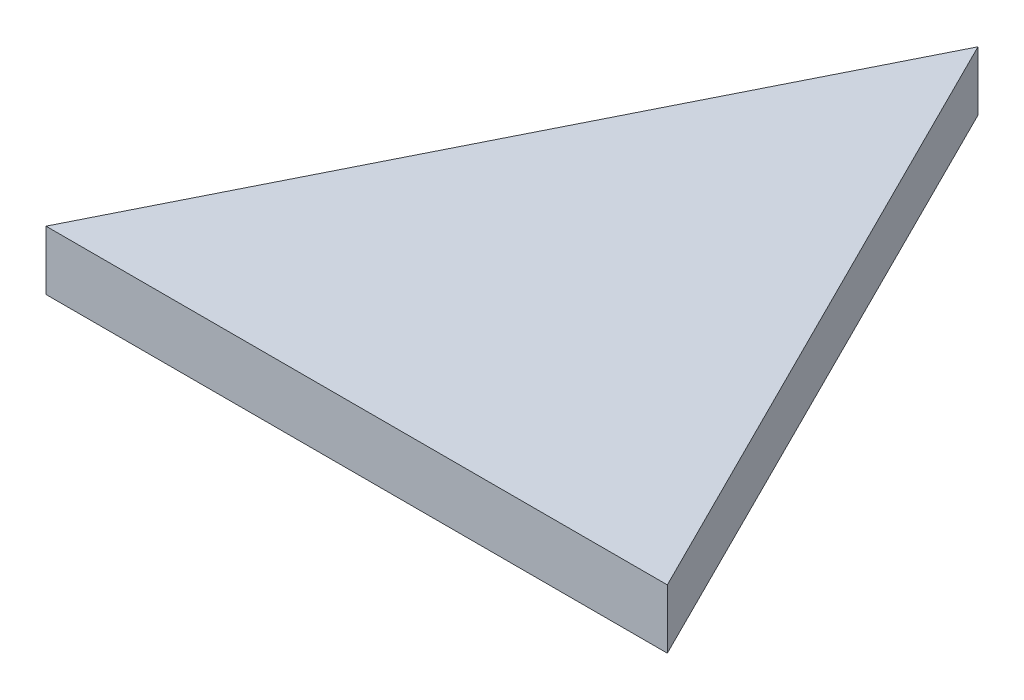
ISO-10303-21;
HEADER;
FILE_DESCRIPTION(('STEP AP214'),'2;1');
FILE_NAME('part.step','',(''),(''),'','','');
FILE_SCHEMA(('AUTOMOTIVE_DESIGN { 1 0 10303 214 1 1 1 1 }'));
ENDSEC;
DATA;
#1=APPLICATION_CONTEXT('core data for automotive mechanical design processes');
#2=APPLICATION_PROTOCOL_DEFINITION('international standard','automotive_design',2000,#1);
#3=PRODUCT_CONTEXT('',#1,'mechanical');
#4=PRODUCT('Part','Part','',(#3));
#5=PRODUCT_RELATED_PRODUCT_CATEGORY('part','',(#4));
#6=PRODUCT_DEFINITION_FORMATION('','',#4);
#7=PRODUCT_DEFINITION_CONTEXT('part definition',#1,'design');
#8=PRODUCT_DEFINITION('design','',#6,#7);
#9=PRODUCT_DEFINITION_SHAPE('','',#8);
#10=(LENGTH_UNIT() NAMED_UNIT(*) SI_UNIT(.MILLI.,.METRE.));
#11=(NAMED_UNIT(*) PLANE_ANGLE_UNIT() SI_UNIT($,.RADIAN.));
#12=(NAMED_UNIT(*) SI_UNIT($,.STERADIAN.) SOLID_ANGLE_UNIT());
#13=UNCERTAINTY_MEASURE_WITH_UNIT(LENGTH_MEASURE(1.E-05),#10,'distance_accuracy_value','');
#14=(GEOMETRIC_REPRESENTATION_CONTEXT(3) GLOBAL_UNCERTAINTY_ASSIGNED_CONTEXT((#13)) GLOBAL_UNIT_ASSIGNED_CONTEXT((#10,
#11,#12)) REPRESENTATION_CONTEXT('',''));
#15=CARTESIAN_POINT('',(0.,0.,0.));
#16=DIRECTION('',(0.,0.,1.));
#17=DIRECTION('',(1.,0.,0.));
#18=AXIS2_PLACEMENT_3D('',#15,#16,#17);
#19=CARTESIAN_POINT('',(0.,150.94635623731,-100.));
#20=DIRECTION('',(0.894427190999916,0.,0.447213595499958));
#21=DIRECTION('',(0.447213595499958,0.,-0.894427190999916));
#22=AXIS2_PLACEMENT_3D('',#19,#20,#21);
#23=PLANE('',#22);
#24=DIRECTION('',(-0.447213595499958,0.,0.894427190999916));
#25=VECTOR('',#24,1.);
#26=CARTESIAN_POINT('',(0.,9.52500000000001,-100.));
#27=LINE('',#26,#25);
#28=CARTESIAN_POINT('',(0.,9.52500000000001,-100.));
#29=VERTEX_POINT('',#28);
#30=CARTESIAN_POINT('',(-50.,9.52500000000001,0.));
#31=VERTEX_POINT('',#30);
#32=EDGE_CURVE('E42',#29,#31,#27,.T.);
#33=ORIENTED_EDGE('',*,*,#32,.F.);
#34=DIRECTION('',(0.,-1.,0.));
#35=VECTOR('',#34,1.);
#36=CARTESIAN_POINT('',(0.,150.94635623731,-100.));
#37=LINE('',#36,#35);
#38=CARTESIAN_POINT('',(0.,0.,-100.));
#39=VERTEX_POINT('',#38);
#40=EDGE_CURVE('E37',#29,#39,#37,.T.);
#41=ORIENTED_EDGE('',*,*,#40,.T.);
#42=DIRECTION('',(-0.447213595499958,0.,0.894427190999916));
#43=VECTOR('',#42,1.);
#44=CARTESIAN_POINT('',(0.,0.,-100.));
#45=LINE('',#44,#43);
#46=CARTESIAN_POINT('',(-50.,0.,0.));
#47=VERTEX_POINT('',#46);
#48=EDGE_CURVE('E72',#39,#47,#45,.T.);
#49=ORIENTED_EDGE('',*,*,#48,.T.);
#50=DIRECTION('',(0.,-1.,0.));
#51=VECTOR('',#50,1.);
#52=CARTESIAN_POINT('',(-50.,150.94635623731,0.));
#53=LINE('',#52,#51);
#54=EDGE_CURVE('E67',#31,#47,#53,.T.);
#55=ORIENTED_EDGE('',*,*,#54,.F.);
#56=EDGE_LOOP('',(#33,#41,#49,#55));
#57=FACE_BOUND('',#56,.T.);
#58=ADVANCED_FACE('F33',(#57),#23,.F.);
#59=CARTESIAN_POINT('',(-50.,150.94635623731,0.));
#60=DIRECTION('',(0.,0.,-1.));
#61=DIRECTION('',(-1.,0.,0.));
#62=AXIS2_PLACEMENT_3D('',#59,#60,#61);
#63=PLANE('',#62);
#64=DIRECTION('',(1.,0.,0.));
#65=VECTOR('',#64,1.);
#66=CARTESIAN_POINT('',(-50.,9.52500000000001,0.));
#67=LINE('',#66,#65);
#68=CARTESIAN_POINT('',(50.,9.52500000000001,0.));
#69=VERTEX_POINT('',#68);
#70=EDGE_CURVE('E11',#31,#69,#67,.T.);
#71=ORIENTED_EDGE('',*,*,#70,.F.);
#72=ORIENTED_EDGE('',*,*,#54,.T.);
#73=DIRECTION('',(1.,0.,0.));
#74=VECTOR('',#73,1.);
#75=CARTESIAN_POINT('',(-50.,0.,0.));
#76=LINE('',#75,#74);
#77=CARTESIAN_POINT('',(50.,0.,0.));
#78=VERTEX_POINT('',#77);
#79=EDGE_CURVE('E82',#47,#78,#76,.T.);
#80=ORIENTED_EDGE('',*,*,#79,.T.);
#81=DIRECTION('',(0.,-1.,0.));
#82=VECTOR('',#81,1.);
#83=CARTESIAN_POINT('',(50.,150.94635623731,0.));
#84=LINE('',#83,#82);
#85=EDGE_CURVE('E55',#69,#78,#84,.T.);
#86=ORIENTED_EDGE('',*,*,#85,.F.);
#87=EDGE_LOOP('',(#71,#72,#80,#86));
#88=FACE_BOUND('',#87,.T.);
#89=ADVANCED_FACE('F88',(#88),#63,.F.);
#90=CARTESIAN_POINT('',(50.,150.94635623731,0.));
#91=DIRECTION('',(-0.894427190999916,0.,0.447213595499958));
#92=DIRECTION('',(0.447213595499958,0.,0.894427190999916));
#93=AXIS2_PLACEMENT_3D('',#90,#91,#92);
#94=PLANE('',#93);
#95=DIRECTION('',(-0.447213595499958,0.,-0.894427190999916));
#96=VECTOR('',#95,1.);
#97=CARTESIAN_POINT('',(50.,9.52500000000001,0.));
#98=LINE('',#97,#96);
#99=EDGE_CURVE('E79',#69,#29,#98,.T.);
#100=ORIENTED_EDGE('',*,*,#99,.F.);
#101=ORIENTED_EDGE('',*,*,#85,.T.);
#102=DIRECTION('',(-0.447213595499958,0.,-0.894427190999916));
#103=VECTOR('',#102,1.);
#104=CARTESIAN_POINT('',(50.,0.,0.));
#105=LINE('',#104,#103);
#106=EDGE_CURVE('E76',#78,#39,#105,.T.);
#107=ORIENTED_EDGE('',*,*,#106,.T.);
#108=ORIENTED_EDGE('',*,*,#40,.F.);
#109=EDGE_LOOP('',(#100,#101,#107,#108));
#110=FACE_BOUND('',#109,.T.);
#111=ADVANCED_FACE('F77',(#110),#94,.F.);
#112=CARTESIAN_POINT('',(0.,0.,0.));
#113=DIRECTION('',(0.,1.,0.));
#114=DIRECTION('',(0.,0.,1.));
#115=AXIS2_PLACEMENT_3D('',#112,#113,#114);
#116=PLANE('',#115);
#117=ORIENTED_EDGE('',*,*,#48,.F.);
#118=ORIENTED_EDGE('',*,*,#106,.F.);
#119=ORIENTED_EDGE('',*,*,#79,.F.);
#120=EDGE_LOOP('',(#117,#118,#119));
#121=FACE_BOUND('',#120,.T.);
#122=ADVANCED_FACE('F81',(#121),#116,.F.);
#123=CARTESIAN_POINT('',(0.,9.525,0.));
#124=DIRECTION('',(0.,1.,0.));
#125=DIRECTION('',(0.,0.,1.));
#126=AXIS2_PLACEMENT_3D('',#123,#124,#125);
#127=PLANE('',#126);
#128=ORIENTED_EDGE('',*,*,#99,.T.);
#129=ORIENTED_EDGE('',*,*,#32,.T.);
#130=ORIENTED_EDGE('',*,*,#70,.T.);
#131=EDGE_LOOP('',(#128,#129,#130));
#132=FACE_BOUND('',#131,.T.);
#133=ADVANCED_FACE('F35',(#132),#127,.T.);
#134=CLOSED_SHELL('',(#58,#89,#111,#122,#133));
#135=MANIFOLD_SOLID_BREP('B2',#134);
#136=ADVANCED_BREP_SHAPE_REPRESENTATION('',(#18,#135),#14);
#137=SHAPE_DEFINITION_REPRESENTATION(#9,#136);
ENDSEC;
END-ISO-10303-21;
